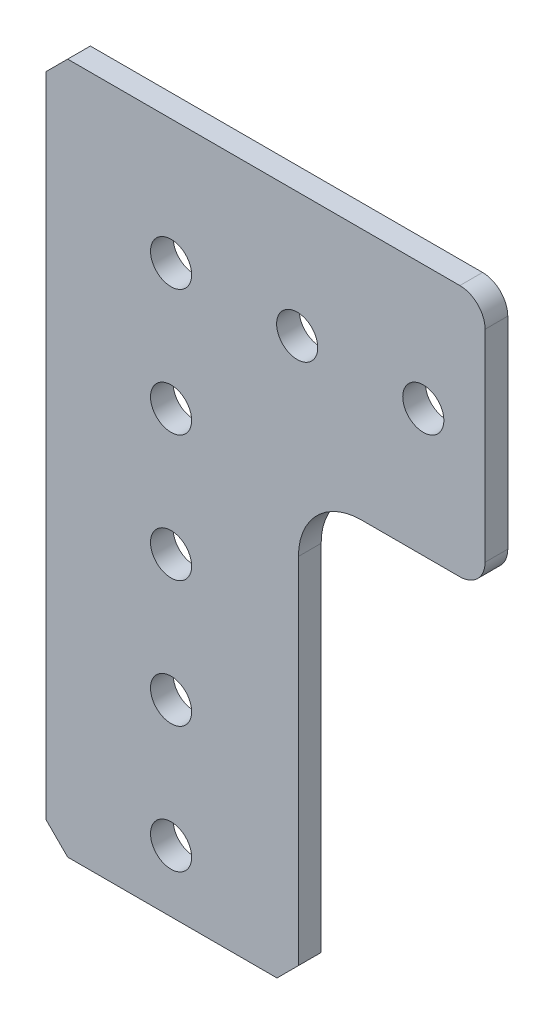
ISO-10303-21;
HEADER;
FILE_DESCRIPTION(('STEP AP214'),'2;1');
FILE_NAME('part.step','',(''),(''),'','','');
FILE_SCHEMA(('AUTOMOTIVE_DESIGN { 1 0 10303 214 1 1 1 1 }'));
ENDSEC;
DATA;
#1=APPLICATION_CONTEXT('core data for automotive mechanical design processes');
#2=APPLICATION_PROTOCOL_DEFINITION('international standard','automotive_design',2000,#1);
#3=PRODUCT_CONTEXT('',#1,'mechanical');
#4=PRODUCT('Part','Part','',(#3));
#5=PRODUCT_RELATED_PRODUCT_CATEGORY('part','',(#4));
#6=PRODUCT_DEFINITION_FORMATION('','',#4);
#7=PRODUCT_DEFINITION_CONTEXT('part definition',#1,'design');
#8=PRODUCT_DEFINITION('design','',#6,#7);
#9=PRODUCT_DEFINITION_SHAPE('','',#8);
#10=(LENGTH_UNIT() NAMED_UNIT(*) SI_UNIT(.MILLI.,.METRE.));
#11=(NAMED_UNIT(*) PLANE_ANGLE_UNIT() SI_UNIT($,.RADIAN.));
#12=(NAMED_UNIT(*) SI_UNIT($,.STERADIAN.) SOLID_ANGLE_UNIT());
#13=UNCERTAINTY_MEASURE_WITH_UNIT(LENGTH_MEASURE(1.E-05),#10,'distance_accuracy_value','');
#14=(GEOMETRIC_REPRESENTATION_CONTEXT(3) GLOBAL_UNCERTAINTY_ASSIGNED_CONTEXT((#13)) GLOBAL_UNIT_ASSIGNED_CONTEXT((#10,
#11,#12)) REPRESENTATION_CONTEXT('',''));
#15=CARTESIAN_POINT('',(0.,0.,0.));
#16=DIRECTION('',(0.,0.,1.));
#17=DIRECTION('',(1.,0.,0.));
#18=AXIS2_PLACEMENT_3D('',#15,#16,#17);
#19=CARTESIAN_POINT('',(-12.573,12.573,0.));
#20=DIRECTION('',(0.,0.,-1.));
#21=DIRECTION('',(-1.,0.,0.));
#22=AXIS2_PLACEMENT_3D('',#19,#20,#21);
#23=PLANE('',#22);
#24=CARTESIAN_POINT('',(3.9907631702977E-13,-38.1,0.));
#25=DIRECTION('',(0.,0.,-1.));
#26=DIRECTION('',(-1.,0.,0.));
#27=AXIS2_PLACEMENT_3D('',#24,#25,#26);
#28=CIRCLE('',#27,2.0701);
#29=CARTESIAN_POINT('',(-2.0700999999996,-38.1,0.));
#30=VERTEX_POINT('',#29);
#31=EDGE_CURVE('E276',#30,#30,#28,.F.);
#32=ORIENTED_EDGE('',*,*,#31,.T.);
#33=EDGE_LOOP('',(#32));
#34=FACE_BOUND('',#33,.T.);
#35=CARTESIAN_POINT('',(1.33025439009923E-13,-12.7,0.));
#36=DIRECTION('',(0.,0.,-1.));
#37=DIRECTION('',(-1.,0.,0.));
#38=AXIS2_PLACEMENT_3D('',#35,#36,#37);
#39=CIRCLE('',#38,2.0701);
#40=CARTESIAN_POINT('',(-2.07009999999987,-12.7,0.));
#41=VERTEX_POINT('',#40);
#42=EDGE_CURVE('E273',#41,#41,#39,.F.);
#43=ORIENTED_EDGE('',*,*,#42,.T.);
#44=EDGE_LOOP('',(#43));
#45=FACE_BOUND('',#44,.T.);
#46=CARTESIAN_POINT('',(25.4,3.54734504026462E-13,0.));
#47=DIRECTION('',(0.,0.,-1.));
#48=DIRECTION('',(-1.,0.,0.));
#49=AXIS2_PLACEMENT_3D('',#46,#47,#48);
#50=CIRCLE('',#49,2.0701);
#51=CARTESIAN_POINT('',(23.3299,3.54734504026462E-13,0.));
#52=VERTEX_POINT('',#51);
#53=EDGE_CURVE('E270',#52,#52,#50,.F.);
#54=ORIENTED_EDGE('',*,*,#53,.T.);
#55=EDGE_LOOP('',(#54));
#56=FACE_BOUND('',#55,.T.);
#57=CARTESIAN_POINT('',(0.,0.,0.));
#58=DIRECTION('',(0.,0.,-1.));
#59=DIRECTION('',(-1.,0.,0.));
#60=AXIS2_PLACEMENT_3D('',#57,#58,#59);
#61=CIRCLE('',#60,2.0701);
#62=CARTESIAN_POINT('',(-2.0701,0.,0.));
#63=VERTEX_POINT('',#62);
#64=EDGE_CURVE('E267',#63,#63,#61,.F.);
#65=ORIENTED_EDGE('',*,*,#64,.T.);
#66=EDGE_LOOP('',(#65));
#67=FACE_BOUND('',#66,.T.);
#68=CARTESIAN_POINT('',(12.7,1.77367252013231E-13,0.));
#69=DIRECTION('',(0.,0.,-1.));
#70=DIRECTION('',(-1.,0.,0.));
#71=AXIS2_PLACEMENT_3D('',#68,#69,#70);
#72=CIRCLE('',#71,2.0701);
#73=CARTESIAN_POINT('',(10.6299,1.77367252013231E-13,0.));
#74=VERTEX_POINT('',#73);
#75=EDGE_CURVE('E264',#74,#74,#72,.F.);
#76=ORIENTED_EDGE('',*,*,#75,.T.);
#77=EDGE_LOOP('',(#76));
#78=FACE_BOUND('',#77,.T.);
#79=CARTESIAN_POINT('',(2.66050878019847E-13,-25.4,0.));
#80=DIRECTION('',(0.,0.,-1.));
#81=DIRECTION('',(-1.,0.,0.));
#82=AXIS2_PLACEMENT_3D('',#79,#80,#81);
#83=CIRCLE('',#82,2.0701);
#84=CARTESIAN_POINT('',(-2.07009999999973,-25.4,0.));
#85=VERTEX_POINT('',#84);
#86=EDGE_CURVE('E261',#85,#85,#83,.F.);
#87=ORIENTED_EDGE('',*,*,#86,.T.);
#88=EDGE_LOOP('',(#87));
#89=FACE_BOUND('',#88,.T.);
#90=CARTESIAN_POINT('',(0.,-50.8,0.));
#91=DIRECTION('',(0.,0.,-1.));
#92=DIRECTION('',(-1.,0.,0.));
#93=AXIS2_PLACEMENT_3D('',#90,#91,#92);
#94=CIRCLE('',#93,2.0701);
#95=CARTESIAN_POINT('',(-2.07009999999999,-50.8,0.));
#96=VERTEX_POINT('',#95);
#97=EDGE_CURVE('E258',#96,#96,#94,.F.);
#98=ORIENTED_EDGE('',*,*,#97,.T.);
#99=EDGE_LOOP('',(#98));
#100=FACE_BOUND('',#99,.T.);
#101=DIRECTION('',(0.,-1.,0.));
#102=VECTOR('',#101,1.);
#103=CARTESIAN_POINT('',(31.623,12.573,0.));
#104=LINE('',#103,#102);
#105=CARTESIAN_POINT('',(31.623,10.033,0.));
#106=VERTEX_POINT('',#105);
#107=CARTESIAN_POINT('',(31.623,-10.287,0.));
#108=VERTEX_POINT('',#107);
#109=EDGE_CURVE('E279',#106,#108,#104,.T.);
#110=ORIENTED_EDGE('',*,*,#109,.T.);
#111=CARTESIAN_POINT('',(29.083,-10.287,0.));
#112=DIRECTION('',(0.,0.,-1.));
#113=DIRECTION('',(-1.,0.,0.));
#114=AXIS2_PLACEMENT_3D('',#111,#112,#113);
#115=CIRCLE('',#114,2.54);
#116=CARTESIAN_POINT('',(29.083,-12.827,0.));
#117=VERTEX_POINT('',#116);
#118=EDGE_CURVE('E43',#108,#117,#115,.T.);
#119=ORIENTED_EDGE('',*,*,#118,.T.);
#120=DIRECTION('',(1.,0.,0.));
#121=VECTOR('',#120,1.);
#122=CARTESIAN_POINT('',(0.,-12.827,0.));
#123=LINE('',#122,#121);
#124=CARTESIAN_POINT('',(19.177,-12.827,0.));
#125=VERTEX_POINT('',#124);
#126=EDGE_CURVE('E206',#125,#117,#123,.T.);
#127=ORIENTED_EDGE('',*,*,#126,.F.);
#128=CARTESIAN_POINT('',(19.177,-19.177,0.));
#129=DIRECTION('',(0.,0.,1.));
#130=DIRECTION('',(1.,0.,0.));
#131=AXIS2_PLACEMENT_3D('',#128,#129,#130);
#132=CIRCLE('',#131,6.35);
#133=CARTESIAN_POINT('',(12.827,-19.177,0.));
#134=VERTEX_POINT('',#133);
#135=EDGE_CURVE('E205',#125,#134,#132,.T.);
#136=ORIENTED_EDGE('',*,*,#135,.T.);
#137=DIRECTION('',(0.,-1.,0.));
#138=VECTOR('',#137,1.);
#139=CARTESIAN_POINT('',(12.827,0.,0.));
#140=LINE('',#139,#138);
#141=CARTESIAN_POINT('',(12.827,-54.864,0.));
#142=VERTEX_POINT('',#141);
#143=EDGE_CURVE('E199',#134,#142,#140,.T.);
#144=ORIENTED_EDGE('',*,*,#143,.T.);
#145=DIRECTION('',(-0.707106781186547,-0.707106781186548,0.));
#146=VECTOR('',#145,1.);
#147=CARTESIAN_POINT('',(12.827,-54.864,0.));
#148=LINE('',#147,#146);
#149=CARTESIAN_POINT('',(10.668,-57.023,0.));
#150=VERTEX_POINT('',#149);
#151=EDGE_CURVE('E188',#142,#150,#148,.T.);
#152=ORIENTED_EDGE('',*,*,#151,.T.);
#153=DIRECTION('',(-1.,0.,0.));
#154=VECTOR('',#153,1.);
#155=CARTESIAN_POINT('',(12.827,-57.023,0.));
#156=LINE('',#155,#154);
#157=CARTESIAN_POINT('',(-10.414,-57.023,0.));
#158=VERTEX_POINT('',#157);
#159=EDGE_CURVE('E177',#150,#158,#156,.T.);
#160=ORIENTED_EDGE('',*,*,#159,.T.);
#161=DIRECTION('',(-0.707106781186548,0.707106781186548,0.));
#162=VECTOR('',#161,1.);
#163=CARTESIAN_POINT('',(-10.414,-57.023,0.));
#164=LINE('',#163,#162);
#165=CARTESIAN_POINT('',(-12.573,-54.864,0.));
#166=VERTEX_POINT('',#165);
#167=EDGE_CURVE('E166',#158,#166,#164,.T.);
#168=ORIENTED_EDGE('',*,*,#167,.T.);
#169=DIRECTION('',(0.,1.,0.));
#170=VECTOR('',#169,1.);
#171=CARTESIAN_POINT('',(-12.573,-57.023,0.));
#172=LINE('',#171,#170);
#173=CARTESIAN_POINT('',(-12.573,10.414,0.));
#174=VERTEX_POINT('',#173);
#175=EDGE_CURVE('E158',#166,#174,#172,.T.);
#176=ORIENTED_EDGE('',*,*,#175,.T.);
#177=DIRECTION('',(0.707106781186548,0.707106781186548,0.));
#178=VECTOR('',#177,1.);
#179=CARTESIAN_POINT('',(-12.573,10.414,0.));
#180=LINE('',#179,#178);
#181=CARTESIAN_POINT('',(-10.414,12.573,0.));
#182=VERTEX_POINT('',#181);
#183=EDGE_CURVE('E132',#174,#182,#180,.T.);
#184=ORIENTED_EDGE('',*,*,#183,.T.);
#185=DIRECTION('',(1.,0.,0.));
#186=VECTOR('',#185,1.);
#187=CARTESIAN_POINT('',(-12.573,12.573,0.));
#188=LINE('',#187,#186);
#189=CARTESIAN_POINT('',(29.083,12.573,0.));
#190=VERTEX_POINT('',#189);
#191=EDGE_CURVE('E128',#182,#190,#188,.T.);
#192=ORIENTED_EDGE('',*,*,#191,.T.);
#193=CARTESIAN_POINT('',(29.083,10.033,0.));
#194=DIRECTION('',(0.,0.,-1.));
#195=DIRECTION('',(-1.,0.,0.));
#196=AXIS2_PLACEMENT_3D('',#193,#194,#195);
#197=CIRCLE('',#196,2.54);
#198=EDGE_CURVE('E308',#190,#106,#197,.T.);
#199=ORIENTED_EDGE('',*,*,#198,.T.);
#200=EDGE_LOOP('',(#110,#119,#127,#136,#144,#152,#160,#168,#176,#184,#192,#199));
#201=FACE_BOUND('',#200,.T.);
#202=ADVANCED_FACE('F35',(#34,#45,#56,#67,#78,#89,#100,#201),#23,.T.);
#203=CARTESIAN_POINT('',(-12.573,12.573,2.286));
#204=DIRECTION('',(0.,-1.,0.));
#205=DIRECTION('',(0.,0.,-1.));
#206=AXIS2_PLACEMENT_3D('',#203,#204,#205);
#207=PLANE('',#206);
#208=DIRECTION('',(-1.,0.,0.));
#209=VECTOR('',#208,1.);
#210=CARTESIAN_POINT('',(-12.573,12.573,2.286));
#211=LINE('',#210,#209);
#212=CARTESIAN_POINT('',(-10.414,12.573,2.286));
#213=VERTEX_POINT('',#212);
#214=CARTESIAN_POINT('',(29.083,12.573,2.286));
#215=VERTEX_POINT('',#214);
#216=EDGE_CURVE('E127',#213,#215,#211,.F.);
#217=ORIENTED_EDGE('',*,*,#216,.T.);
#218=DIRECTION('',(0.,0.,1.));
#219=VECTOR('',#218,1.);
#220=CARTESIAN_POINT('',(29.083,12.573,0.));
#221=LINE('',#220,#219);
#222=EDGE_CURVE('E12',#215,#190,#221,.F.);
#223=ORIENTED_EDGE('',*,*,#222,.T.);
#224=ORIENTED_EDGE('',*,*,#191,.F.);
#225=DIRECTION('',(0.,0.,-1.));
#226=VECTOR('',#225,1.);
#227=CARTESIAN_POINT('',(-10.414,12.573,2.286));
#228=LINE('',#227,#226);
#229=EDGE_CURVE('E124',#213,#182,#228,.T.);
#230=ORIENTED_EDGE('',*,*,#229,.F.);
#231=EDGE_LOOP('',(#217,#223,#224,#230));
#232=FACE_BOUND('',#231,.T.);
#233=ADVANCED_FACE('F126',(#232),#207,.F.);
#234=CARTESIAN_POINT('',(0.,-12.827,0.));
#235=DIRECTION('',(0.,-1.,0.));
#236=DIRECTION('',(0.,0.,-1.));
#237=AXIS2_PLACEMENT_3D('',#234,#235,#236);
#238=PLANE('',#237);
#239=ORIENTED_EDGE('',*,*,#126,.T.);
#240=DIRECTION('',(0.,0.,1.));
#241=VECTOR('',#240,1.);
#242=CARTESIAN_POINT('',(29.083,-12.827,0.));
#243=LINE('',#242,#241);
#244=CARTESIAN_POINT('',(29.083,-12.827,2.286));
#245=VERTEX_POINT('',#244);
#246=EDGE_CURVE('E282',#117,#245,#243,.T.);
#247=ORIENTED_EDGE('',*,*,#246,.T.);
#248=DIRECTION('',(-1.,0.,0.));
#249=VECTOR('',#248,1.);
#250=CARTESIAN_POINT('',(-12.573,-12.827,2.286));
#251=LINE('',#250,#249);
#252=CARTESIAN_POINT('',(19.177,-12.827,2.286));
#253=VERTEX_POINT('',#252);
#254=EDGE_CURVE('E143',#245,#253,#251,.T.);
#255=ORIENTED_EDGE('',*,*,#254,.T.);
#256=DIRECTION('',(0.,0.,-1.));
#257=VECTOR('',#256,1.);
#258=CARTESIAN_POINT('',(19.177,-12.827,0.));
#259=LINE('',#258,#257);
#260=EDGE_CURVE('E209',#253,#125,#259,.T.);
#261=ORIENTED_EDGE('',*,*,#260,.T.);
#262=EDGE_LOOP('',(#239,#247,#255,#261));
#263=FACE_BOUND('',#262,.T.);
#264=ADVANCED_FACE('F299',(#263),#238,.T.);
#265=CARTESIAN_POINT('',(-12.573,12.573,2.286));
#266=DIRECTION('',(0.,0.,-1.));
#267=DIRECTION('',(-1.,0.,0.));
#268=AXIS2_PLACEMENT_3D('',#265,#266,#267);
#269=PLANE('',#268);
#270=CARTESIAN_POINT('',(3.9907631702977E-13,-38.1,2.286));
#271=DIRECTION('',(0.,0.,-1.));
#272=DIRECTION('',(-1.,0.,0.));
#273=AXIS2_PLACEMENT_3D('',#270,#271,#272);
#274=CIRCLE('',#273,2.0701);
#275=CARTESIAN_POINT('',(-2.0700999999996,-38.1,2.286));
#276=VERTEX_POINT('',#275);
#277=EDGE_CURVE('E254',#276,#276,#274,.F.);
#278=ORIENTED_EDGE('',*,*,#277,.F.);
#279=EDGE_LOOP('',(#278));
#280=FACE_BOUND('',#279,.T.);
#281=CARTESIAN_POINT('',(1.33025439009923E-13,-12.7,2.286));
#282=DIRECTION('',(0.,0.,-1.));
#283=DIRECTION('',(-1.,0.,0.));
#284=AXIS2_PLACEMENT_3D('',#281,#282,#283);
#285=CIRCLE('',#284,2.0701);
#286=CARTESIAN_POINT('',(-2.07009999999987,-12.7,2.286));
#287=VERTEX_POINT('',#286);
#288=EDGE_CURVE('E251',#287,#287,#285,.F.);
#289=ORIENTED_EDGE('',*,*,#288,.F.);
#290=EDGE_LOOP('',(#289));
#291=FACE_BOUND('',#290,.T.);
#292=CARTESIAN_POINT('',(25.4,3.54734504026462E-13,2.286));
#293=DIRECTION('',(0.,0.,-1.));
#294=DIRECTION('',(-1.,0.,0.));
#295=AXIS2_PLACEMENT_3D('',#292,#293,#294);
#296=CIRCLE('',#295,2.0701);
#297=CARTESIAN_POINT('',(23.3299,3.54734504026462E-13,2.286));
#298=VERTEX_POINT('',#297);
#299=EDGE_CURVE('E248',#298,#298,#296,.F.);
#300=ORIENTED_EDGE('',*,*,#299,.F.);
#301=EDGE_LOOP('',(#300));
#302=FACE_BOUND('',#301,.T.);
#303=CARTESIAN_POINT('',(0.,0.,2.286));
#304=DIRECTION('',(0.,0.,-1.));
#305=DIRECTION('',(-1.,0.,0.));
#306=AXIS2_PLACEMENT_3D('',#303,#304,#305);
#307=CIRCLE('',#306,2.0701);
#308=CARTESIAN_POINT('',(-2.0701,0.,2.286));
#309=VERTEX_POINT('',#308);
#310=EDGE_CURVE('E245',#309,#309,#307,.F.);
#311=ORIENTED_EDGE('',*,*,#310,.F.);
#312=EDGE_LOOP('',(#311));
#313=FACE_BOUND('',#312,.T.);
#314=CARTESIAN_POINT('',(12.7,1.77367252013231E-13,2.286));
#315=DIRECTION('',(0.,0.,-1.));
#316=DIRECTION('',(-1.,0.,0.));
#317=AXIS2_PLACEMENT_3D('',#314,#315,#316);
#318=CIRCLE('',#317,2.0701);
#319=CARTESIAN_POINT('',(10.6299,1.77367252013231E-13,2.286));
#320=VERTEX_POINT('',#319);
#321=EDGE_CURVE('E242',#320,#320,#318,.F.);
#322=ORIENTED_EDGE('',*,*,#321,.F.);
#323=EDGE_LOOP('',(#322));
#324=FACE_BOUND('',#323,.T.);
#325=CARTESIAN_POINT('',(2.66050878019847E-13,-25.4,2.286));
#326=DIRECTION('',(0.,0.,-1.));
#327=DIRECTION('',(-1.,0.,0.));
#328=AXIS2_PLACEMENT_3D('',#325,#326,#327);
#329=CIRCLE('',#328,2.0701);
#330=CARTESIAN_POINT('',(-2.07009999999973,-25.4,2.286));
#331=VERTEX_POINT('',#330);
#332=EDGE_CURVE('E239',#331,#331,#329,.F.);
#333=ORIENTED_EDGE('',*,*,#332,.F.);
#334=EDGE_LOOP('',(#333));
#335=FACE_BOUND('',#334,.T.);
#336=CARTESIAN_POINT('',(0.,-50.8,2.286));
#337=DIRECTION('',(0.,0.,-1.));
#338=DIRECTION('',(-1.,0.,0.));
#339=AXIS2_PLACEMENT_3D('',#336,#337,#338);
#340=CIRCLE('',#339,2.0701);
#341=CARTESIAN_POINT('',(-2.07009999999999,-50.8,2.286));
#342=VERTEX_POINT('',#341);
#343=EDGE_CURVE('E236',#342,#342,#340,.F.);
#344=ORIENTED_EDGE('',*,*,#343,.F.);
#345=EDGE_LOOP('',(#344));
#346=FACE_BOUND('',#345,.T.);
#347=ORIENTED_EDGE('',*,*,#254,.F.);
#348=CARTESIAN_POINT('',(29.083,-10.287,2.286));
#349=DIRECTION('',(0.,0.,-1.));
#350=DIRECTION('',(-1.,0.,0.));
#351=AXIS2_PLACEMENT_3D('',#348,#349,#350);
#352=CIRCLE('',#351,2.54);
#353=CARTESIAN_POINT('',(31.623,-10.287,2.286));
#354=VERTEX_POINT('',#353);
#355=EDGE_CURVE('E315',#245,#354,#352,.F.);
#356=ORIENTED_EDGE('',*,*,#355,.T.);
#357=DIRECTION('',(0.,-1.,0.));
#358=VECTOR('',#357,1.);
#359=CARTESIAN_POINT('',(31.623,12.573,2.286));
#360=LINE('',#359,#358);
#361=CARTESIAN_POINT('',(31.623,10.033,2.286));
#362=VERTEX_POINT('',#361);
#363=EDGE_CURVE('E280',#362,#354,#360,.T.);
#364=ORIENTED_EDGE('',*,*,#363,.F.);
#365=CARTESIAN_POINT('',(29.083,10.033,2.286));
#366=DIRECTION('',(0.,0.,-1.));
#367=DIRECTION('',(-1.,0.,0.));
#368=AXIS2_PLACEMENT_3D('',#365,#366,#367);
#369=CIRCLE('',#368,2.54);
#370=EDGE_CURVE('E142',#362,#215,#369,.F.);
#371=ORIENTED_EDGE('',*,*,#370,.T.);
#372=ORIENTED_EDGE('',*,*,#216,.F.);
#373=DIRECTION('',(0.707106781186545,0.70710678118655,0.));
#374=VECTOR('',#373,1.);
#375=CARTESIAN_POINT('',(-12.573,10.414,2.286));
#376=LINE('',#375,#374);
#377=CARTESIAN_POINT('',(-12.573,10.414,2.286));
#378=VERTEX_POINT('',#377);
#379=EDGE_CURVE('E139',#378,#213,#376,.T.);
#380=ORIENTED_EDGE('',*,*,#379,.F.);
#381=DIRECTION('',(0.,1.,0.));
#382=VECTOR('',#381,1.);
#383=CARTESIAN_POINT('',(-12.573,12.573,2.286));
#384=LINE('',#383,#382);
#385=CARTESIAN_POINT('',(-12.573,-54.864,2.286));
#386=VERTEX_POINT('',#385);
#387=EDGE_CURVE('E148',#386,#378,#384,.T.);
#388=ORIENTED_EDGE('',*,*,#387,.F.);
#389=DIRECTION('',(-0.707106781186547,0.707106781186548,0.));
#390=VECTOR('',#389,1.);
#391=CARTESIAN_POINT('',(-10.414,-57.023,2.286));
#392=LINE('',#391,#390);
#393=CARTESIAN_POINT('',(-10.414,-57.023,2.286));
#394=VERTEX_POINT('',#393);
#395=EDGE_CURVE('E150',#394,#386,#392,.T.);
#396=ORIENTED_EDGE('',*,*,#395,.F.);
#397=DIRECTION('',(-1.,0.,0.));
#398=VECTOR('',#397,1.);
#399=CARTESIAN_POINT('',(-12.573,-57.023,2.286));
#400=LINE('',#399,#398);
#401=CARTESIAN_POINT('',(10.668,-57.023,2.286));
#402=VERTEX_POINT('',#401);
#403=EDGE_CURVE('E171',#402,#394,#400,.T.);
#404=ORIENTED_EDGE('',*,*,#403,.F.);
#405=DIRECTION('',(-0.70710678118655,-0.707106781186545,0.));
#406=VECTOR('',#405,1.);
#407=CARTESIAN_POINT('',(12.827,-54.864,2.286));
#408=LINE('',#407,#406);
#409=CARTESIAN_POINT('',(12.827,-54.864,2.286));
#410=VERTEX_POINT('',#409);
#411=EDGE_CURVE('E182',#410,#402,#408,.T.);
#412=ORIENTED_EDGE('',*,*,#411,.F.);
#413=DIRECTION('',(0.,1.,0.));
#414=VECTOR('',#413,1.);
#415=CARTESIAN_POINT('',(12.827,12.573,2.286));
#416=LINE('',#415,#414);
#417=CARTESIAN_POINT('',(12.827,-19.177,2.286));
#418=VERTEX_POINT('',#417);
#419=EDGE_CURVE('E193',#418,#410,#416,.F.);
#420=ORIENTED_EDGE('',*,*,#419,.F.);
#421=CARTESIAN_POINT('',(19.177,-19.177,2.286));
#422=DIRECTION('',(0.,0.,1.));
#423=DIRECTION('',(1.,0.,0.));
#424=AXIS2_PLACEMENT_3D('',#421,#422,#423);
#425=CIRCLE('',#424,6.35);
#426=EDGE_CURVE('E233',#253,#418,#425,.T.);
#427=ORIENTED_EDGE('',*,*,#426,.F.);
#428=EDGE_LOOP('',(#347,#356,#364,#371,#372,#380,#388,#396,#404,#412,#420,#427));
#429=FACE_BOUND('',#428,.T.);
#430=ADVANCED_FACE('F137',(#280,#291,#302,#313,#324,#335,#346,#429),#269,.F.);
#431=CARTESIAN_POINT('',(3.9907631702977E-13,-38.1,2.286));
#432=DIRECTION('',(0.,0.,-1.));
#433=DIRECTION('',(-1.,0.,0.));
#434=AXIS2_PLACEMENT_3D('',#431,#432,#433);
#435=CYLINDRICAL_SURFACE('',#434,2.0701);
#436=ORIENTED_EDGE('',*,*,#31,.F.);
#437=EDGE_LOOP('',(#436));
#438=FACE_BOUND('',#437,.T.);
#439=ORIENTED_EDGE('',*,*,#277,.T.);
#440=EDGE_LOOP('',(#439));
#441=FACE_BOUND('',#440,.T.);
#442=ADVANCED_FACE('F353',(#438,#441),#435,.F.);
#443=CARTESIAN_POINT('',(1.33025439009923E-13,-12.7,2.286));
#444=DIRECTION('',(0.,0.,-1.));
#445=DIRECTION('',(-1.,0.,0.));
#446=AXIS2_PLACEMENT_3D('',#443,#444,#445);
#447=CYLINDRICAL_SURFACE('',#446,2.0701);
#448=ORIENTED_EDGE('',*,*,#42,.F.);
#449=EDGE_LOOP('',(#448));
#450=FACE_BOUND('',#449,.T.);
#451=ORIENTED_EDGE('',*,*,#288,.T.);
#452=EDGE_LOOP('',(#451));
#453=FACE_BOUND('',#452,.T.);
#454=ADVANCED_FACE('F367',(#450,#453),#447,.F.);
#455=CARTESIAN_POINT('',(25.4,3.54734504026462E-13,2.286));
#456=DIRECTION('',(0.,0.,-1.));
#457=DIRECTION('',(-1.,0.,0.));
#458=AXIS2_PLACEMENT_3D('',#455,#456,#457);
#459=CYLINDRICAL_SURFACE('',#458,2.0701);
#460=ORIENTED_EDGE('',*,*,#53,.F.);
#461=EDGE_LOOP('',(#460));
#462=FACE_BOUND('',#461,.T.);
#463=ORIENTED_EDGE('',*,*,#299,.T.);
#464=EDGE_LOOP('',(#463));
#465=FACE_BOUND('',#464,.T.);
#466=ADVANCED_FACE('F373',(#462,#465),#459,.F.);
#467=CARTESIAN_POINT('',(0.,0.,2.286));
#468=DIRECTION('',(0.,0.,-1.));
#469=DIRECTION('',(-1.,0.,0.));
#470=AXIS2_PLACEMENT_3D('',#467,#468,#469);
#471=CYLINDRICAL_SURFACE('',#470,2.0701);
#472=ORIENTED_EDGE('',*,*,#64,.F.);
#473=EDGE_LOOP('',(#472));
#474=FACE_BOUND('',#473,.T.);
#475=ORIENTED_EDGE('',*,*,#310,.T.);
#476=EDGE_LOOP('',(#475));
#477=FACE_BOUND('',#476,.T.);
#478=ADVANCED_FACE('F410',(#474,#477),#471,.F.);
#479=CARTESIAN_POINT('',(12.7,1.77367252013231E-13,2.286));
#480=DIRECTION('',(0.,0.,-1.));
#481=DIRECTION('',(-1.,0.,0.));
#482=AXIS2_PLACEMENT_3D('',#479,#480,#481);
#483=CYLINDRICAL_SURFACE('',#482,2.0701);
#484=ORIENTED_EDGE('',*,*,#75,.F.);
#485=EDGE_LOOP('',(#484));
#486=FACE_BOUND('',#485,.T.);
#487=ORIENTED_EDGE('',*,*,#321,.T.);
#488=EDGE_LOOP('',(#487));
#489=FACE_BOUND('',#488,.T.);
#490=ADVANCED_FACE('F402',(#486,#489),#483,.F.);
#491=CARTESIAN_POINT('',(2.66050878019847E-13,-25.4,2.286));
#492=DIRECTION('',(0.,0.,-1.));
#493=DIRECTION('',(-1.,0.,0.));
#494=AXIS2_PLACEMENT_3D('',#491,#492,#493);
#495=CYLINDRICAL_SURFACE('',#494,2.0701);
#496=ORIENTED_EDGE('',*,*,#86,.F.);
#497=EDGE_LOOP('',(#496));
#498=FACE_BOUND('',#497,.T.);
#499=ORIENTED_EDGE('',*,*,#332,.T.);
#500=EDGE_LOOP('',(#499));
#501=FACE_BOUND('',#500,.T.);
#502=ADVANCED_FACE('F394',(#498,#501),#495,.F.);
#503=CARTESIAN_POINT('',(0.,-50.8,2.286));
#504=DIRECTION('',(0.,0.,-1.));
#505=DIRECTION('',(-1.,0.,0.));
#506=AXIS2_PLACEMENT_3D('',#503,#504,#505);
#507=CYLINDRICAL_SURFACE('',#506,2.0701);
#508=ORIENTED_EDGE('',*,*,#97,.F.);
#509=EDGE_LOOP('',(#508));
#510=FACE_BOUND('',#509,.T.);
#511=ORIENTED_EDGE('',*,*,#343,.T.);
#512=EDGE_LOOP('',(#511));
#513=FACE_BOUND('',#512,.T.);
#514=ADVANCED_FACE('F392',(#510,#513),#507,.F.);
#515=CARTESIAN_POINT('',(19.177,-19.177,0.));
#516=DIRECTION('',(0.,0.,1.));
#517=DIRECTION('',(1.,0.,0.));
#518=AXIS2_PLACEMENT_3D('',#515,#516,#517);
#519=CYLINDRICAL_SURFACE('',#518,6.35);
#520=DIRECTION('',(0.,0.,1.));
#521=VECTOR('',#520,1.);
#522=CARTESIAN_POINT('',(12.827,-19.177,0.));
#523=LINE('',#522,#521);
#524=EDGE_CURVE('E202',#418,#134,#523,.F.);
#525=ORIENTED_EDGE('',*,*,#524,.T.);
#526=ORIENTED_EDGE('',*,*,#135,.F.);
#527=ORIENTED_EDGE('',*,*,#260,.F.);
#528=ORIENTED_EDGE('',*,*,#426,.T.);
#529=EDGE_LOOP('',(#525,#526,#527,#528));
#530=FACE_BOUND('',#529,.T.);
#531=ADVANCED_FACE('F318',(#530),#519,.F.);
#532=CARTESIAN_POINT('',(12.827,0.,0.));
#533=DIRECTION('',(-1.,0.,0.));
#534=DIRECTION('',(0.,-1.,0.));
#535=AXIS2_PLACEMENT_3D('',#532,#533,#534);
#536=PLANE('',#535);
#537=DIRECTION('',(0.,0.,1.));
#538=VECTOR('',#537,1.);
#539=CARTESIAN_POINT('',(12.827,-54.864,0.));
#540=LINE('',#539,#538);
#541=EDGE_CURVE('E196',#410,#142,#540,.F.);
#542=ORIENTED_EDGE('',*,*,#541,.T.);
#543=ORIENTED_EDGE('',*,*,#143,.F.);
#544=ORIENTED_EDGE('',*,*,#524,.F.);
#545=ORIENTED_EDGE('',*,*,#419,.T.);
#546=EDGE_LOOP('',(#542,#543,#544,#545));
#547=FACE_BOUND('',#546,.T.);
#548=ADVANCED_FACE('F320',(#547),#536,.F.);
#549=CARTESIAN_POINT('',(12.827,-54.864,0.));
#550=DIRECTION('',(-0.707106781186548,0.707106781186547,0.));
#551=DIRECTION('',(-0.707106781186547,-0.707106781186548,0.));
#552=AXIS2_PLACEMENT_3D('',#549,#550,#551);
#553=PLANE('',#552);
#554=DIRECTION('',(0.,0.,1.));
#555=VECTOR('',#554,1.);
#556=CARTESIAN_POINT('',(10.668,-57.023,2.286));
#557=LINE('',#556,#555);
#558=EDGE_CURVE('E185',#402,#150,#557,.F.);
#559=ORIENTED_EDGE('',*,*,#558,.T.);
#560=ORIENTED_EDGE('',*,*,#151,.F.);
#561=ORIENTED_EDGE('',*,*,#541,.F.);
#562=ORIENTED_EDGE('',*,*,#411,.T.);
#563=EDGE_LOOP('',(#559,#560,#561,#562));
#564=FACE_BOUND('',#563,.T.);
#565=ADVANCED_FACE('F324',(#564),#553,.F.);
#566=CARTESIAN_POINT('',(12.827,-57.023,2.286));
#567=DIRECTION('',(0.,1.,0.));
#568=DIRECTION('',(-1.,0.,0.));
#569=AXIS2_PLACEMENT_3D('',#566,#567,#568);
#570=PLANE('',#569);
#571=ORIENTED_EDGE('',*,*,#558,.F.);
#572=ORIENTED_EDGE('',*,*,#403,.T.);
#573=DIRECTION('',(0.,0.,1.));
#574=VECTOR('',#573,1.);
#575=CARTESIAN_POINT('',(-10.414,-57.023,2.286));
#576=LINE('',#575,#574);
#577=EDGE_CURVE('E174',#394,#158,#576,.F.);
#578=ORIENTED_EDGE('',*,*,#577,.T.);
#579=ORIENTED_EDGE('',*,*,#159,.F.);
#580=EDGE_LOOP('',(#571,#572,#578,#579));
#581=FACE_BOUND('',#580,.T.);
#582=ADVANCED_FACE('F327',(#581),#570,.F.);
#583=CARTESIAN_POINT('',(-10.414,-57.023,2.286));
#584=DIRECTION('',(0.707106781186548,0.707106781186548,0.));
#585=DIRECTION('',(-0.707106781186548,0.707106781186548,0.));
#586=AXIS2_PLACEMENT_3D('',#583,#584,#585);
#587=PLANE('',#586);
#588=DIRECTION('',(0.,0.,1.));
#589=VECTOR('',#588,1.);
#590=CARTESIAN_POINT('',(-12.573,-54.864,2.286));
#591=LINE('',#590,#589);
#592=EDGE_CURVE('E163',#386,#166,#591,.F.);
#593=ORIENTED_EDGE('',*,*,#592,.T.);
#594=ORIENTED_EDGE('',*,*,#167,.F.);
#595=ORIENTED_EDGE('',*,*,#577,.F.);
#596=ORIENTED_EDGE('',*,*,#395,.T.);
#597=EDGE_LOOP('',(#593,#594,#595,#596));
#598=FACE_BOUND('',#597,.T.);
#599=ADVANCED_FACE('F330',(#598),#587,.F.);
#600=CARTESIAN_POINT('',(-12.573,-57.023,2.286));
#601=DIRECTION('',(1.,0.,0.));
#602=DIRECTION('',(0.,1.,0.));
#603=AXIS2_PLACEMENT_3D('',#600,#601,#602);
#604=PLANE('',#603);
#605=ORIENTED_EDGE('',*,*,#592,.F.);
#606=ORIENTED_EDGE('',*,*,#387,.T.);
#607=DIRECTION('',(0.,0.,1.));
#608=VECTOR('',#607,1.);
#609=CARTESIAN_POINT('',(-12.573,10.414,2.286));
#610=LINE('',#609,#608);
#611=EDGE_CURVE('E147',#378,#174,#610,.F.);
#612=ORIENTED_EDGE('',*,*,#611,.T.);
#613=ORIENTED_EDGE('',*,*,#175,.F.);
#614=EDGE_LOOP('',(#605,#606,#612,#613));
#615=FACE_BOUND('',#614,.T.);
#616=ADVANCED_FACE('F334',(#615),#604,.F.);
#617=CARTESIAN_POINT('',(-12.573,10.414,2.286));
#618=DIRECTION('',(0.707106781186548,-0.707106781186548,0.));
#619=DIRECTION('',(0.707106781186548,0.707106781186548,0.));
#620=AXIS2_PLACEMENT_3D('',#617,#618,#619);
#621=PLANE('',#620);
#622=ORIENTED_EDGE('',*,*,#229,.T.);
#623=ORIENTED_EDGE('',*,*,#183,.F.);
#624=ORIENTED_EDGE('',*,*,#611,.F.);
#625=ORIENTED_EDGE('',*,*,#379,.T.);
#626=EDGE_LOOP('',(#622,#623,#624,#625));
#627=FACE_BOUND('',#626,.T.);
#628=ADVANCED_FACE('F145',(#627),#621,.F.);
#629=CARTESIAN_POINT('',(31.623,0.,0.));
#630=DIRECTION('',(1.,0.,0.));
#631=DIRECTION('',(0.,1.,0.));
#632=AXIS2_PLACEMENT_3D('',#629,#630,#631);
#633=PLANE('',#632);
#634=ORIENTED_EDGE('',*,*,#363,.T.);
#635=DIRECTION('',(0.,0.,1.));
#636=VECTOR('',#635,1.);
#637=CARTESIAN_POINT('',(31.623,-10.287,0.));
#638=LINE('',#637,#636);
#639=EDGE_CURVE('E56',#354,#108,#638,.F.);
#640=ORIENTED_EDGE('',*,*,#639,.T.);
#641=ORIENTED_EDGE('',*,*,#109,.F.);
#642=DIRECTION('',(0.,0.,1.));
#643=VECTOR('',#642,1.);
#644=CARTESIAN_POINT('',(31.623,10.033,2.286));
#645=LINE('',#644,#643);
#646=EDGE_CURVE('E312',#106,#362,#645,.T.);
#647=ORIENTED_EDGE('',*,*,#646,.T.);
#648=EDGE_LOOP('',(#634,#640,#641,#647));
#649=FACE_BOUND('',#648,.T.);
#650=ADVANCED_FACE('F341',(#649),#633,.T.);
#651=CARTESIAN_POINT('',(29.083,-10.287,0.));
#652=DIRECTION('',(0.,0.,1.));
#653=DIRECTION('',(1.,0.,0.));
#654=AXIS2_PLACEMENT_3D('',#651,#652,#653);
#655=CYLINDRICAL_SURFACE('',#654,2.54);
#656=ORIENTED_EDGE('',*,*,#118,.F.);
#657=ORIENTED_EDGE('',*,*,#639,.F.);
#658=ORIENTED_EDGE('',*,*,#355,.F.);
#659=ORIENTED_EDGE('',*,*,#246,.F.);
#660=EDGE_LOOP('',(#656,#657,#658,#659));
#661=FACE_BOUND('',#660,.T.);
#662=ADVANCED_FACE('F355',(#661),#655,.T.);
#663=CARTESIAN_POINT('',(29.083,10.033,0.));
#664=DIRECTION('',(0.,0.,-1.));
#665=DIRECTION('',(-1.,0.,0.));
#666=AXIS2_PLACEMENT_3D('',#663,#664,#665);
#667=CYLINDRICAL_SURFACE('',#666,2.54);
#668=ORIENTED_EDGE('',*,*,#198,.F.);
#669=ORIENTED_EDGE('',*,*,#222,.F.);
#670=ORIENTED_EDGE('',*,*,#370,.F.);
#671=ORIENTED_EDGE('',*,*,#646,.F.);
#672=EDGE_LOOP('',(#668,#669,#670,#671));
#673=FACE_BOUND('',#672,.T.);
#674=ADVANCED_FACE('F37',(#673),#667,.T.);
#675=CLOSED_SHELL('',(#202,#233,#264,#430,#442,#454,#466,#478,#490,#502,#514,#531,#548,#565,
#582,#599,#616,#628,#650,#662,#674));
#676=MANIFOLD_SOLID_BREP('B2',#675);
#677=ADVANCED_BREP_SHAPE_REPRESENTATION('',(#18,#676),#14);
#678=SHAPE_DEFINITION_REPRESENTATION(#9,#677);
ENDSEC;
END-ISO-10303-21;
